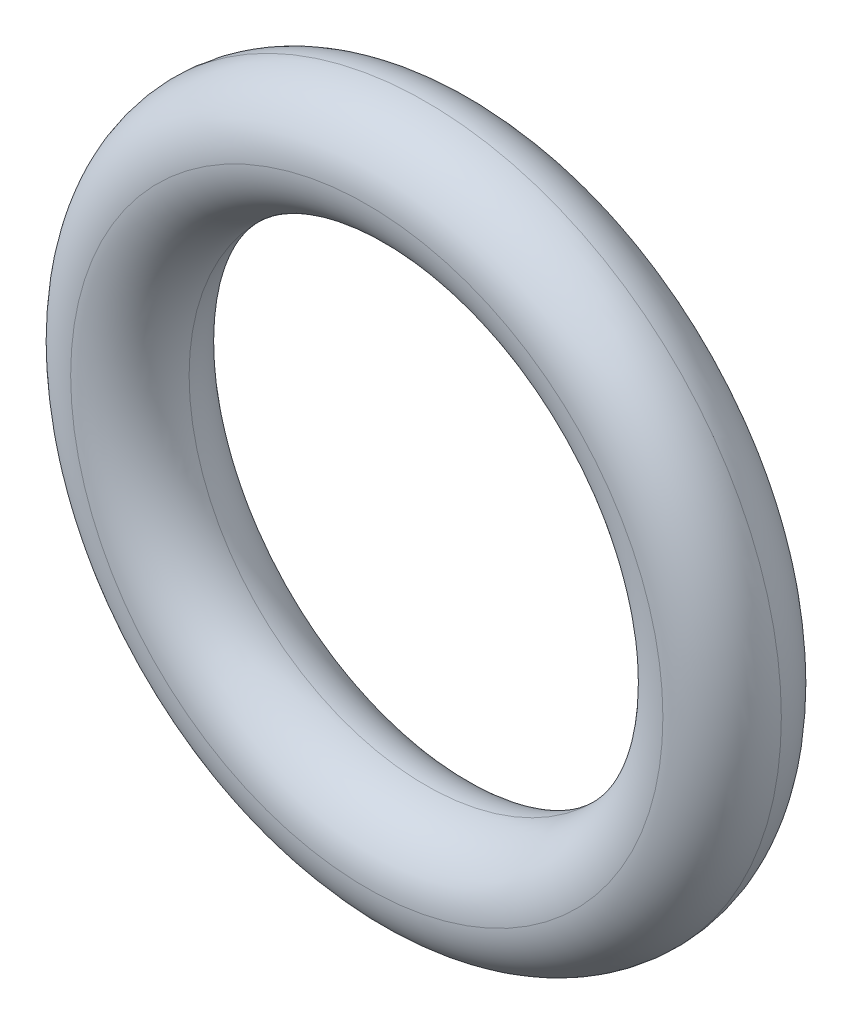
ISO-10303-21;
HEADER;
FILE_DESCRIPTION(('STEP AP214'),'2;1');
FILE_NAME('part.step','',(''),(''),'','','');
FILE_SCHEMA(('AUTOMOTIVE_DESIGN { 1 0 10303 214 1 1 1 1 }'));
ENDSEC;
DATA;
#1=APPLICATION_CONTEXT('core data for automotive mechanical design processes');
#2=APPLICATION_PROTOCOL_DEFINITION('international standard','automotive_design',2000,#1);
#3=PRODUCT_CONTEXT('',#1,'mechanical');
#4=PRODUCT('Part','Part','',(#3));
#5=PRODUCT_RELATED_PRODUCT_CATEGORY('part','',(#4));
#6=PRODUCT_DEFINITION_FORMATION('','',#4);
#7=PRODUCT_DEFINITION_CONTEXT('part definition',#1,'design');
#8=PRODUCT_DEFINITION('design','',#6,#7);
#9=PRODUCT_DEFINITION_SHAPE('','',#8);
#10=(LENGTH_UNIT() NAMED_UNIT(*) SI_UNIT(.MILLI.,.METRE.));
#11=(NAMED_UNIT(*) PLANE_ANGLE_UNIT() SI_UNIT($,.RADIAN.));
#12=(NAMED_UNIT(*) SI_UNIT($,.STERADIAN.) SOLID_ANGLE_UNIT());
#13=UNCERTAINTY_MEASURE_WITH_UNIT(LENGTH_MEASURE(1.E-05),#10,'distance_accuracy_value','');
#14=(GEOMETRIC_REPRESENTATION_CONTEXT(3) GLOBAL_UNCERTAINTY_ASSIGNED_CONTEXT((#13)) GLOBAL_UNIT_ASSIGNED_CONTEXT((#10,
#11,#12)) REPRESENTATION_CONTEXT('',''));
#15=CARTESIAN_POINT('',(0.,0.,0.));
#16=DIRECTION('',(0.,0.,1.));
#17=DIRECTION('',(1.,0.,0.));
#18=AXIS2_PLACEMENT_3D('',#15,#16,#17);
#19=CARTESIAN_POINT('',(0.,0.,12.7));
#20=DIRECTION('',(0.,0.,1.));
#21=DIRECTION('',(1.,0.,0.));
#22=AXIS2_PLACEMENT_3D('',#19,#20,#21);
#23=TOROIDAL_SURFACE('',#22,63.5,12.7);
#24=CARTESIAN_POINT('',(0.,0.,25.4));
#25=DIRECTION('',(0.,0.,1.));
#26=DIRECTION('',(1.,0.,0.));
#27=AXIS2_PLACEMENT_3D('',#24,#25,#26);
#28=CIRCLE('',#27,63.5);
#29=CARTESIAN_POINT('',(63.5,0.,25.4));
#30=VERTEX_POINT('',#29);
#31=EDGE_CURVE('E10',#30,#30,#28,.T.);
#32=ORIENTED_EDGE('',*,*,#31,.F.);
#33=EDGE_LOOP('',(#32));
#34=FACE_BOUND('',#33,.T.);
#35=CARTESIAN_POINT('',(0.,0.,12.7));
#36=DIRECTION('',(0.,0.,1.));
#37=DIRECTION('',(1.,0.,0.));
#38=AXIS2_PLACEMENT_3D('',#35,#36,#37);
#39=CIRCLE('',#38,76.2);
#40=CARTESIAN_POINT('',(76.2,0.,12.7));
#41=VERTEX_POINT('',#40);
#42=EDGE_CURVE('E52',#41,#41,#39,.F.);
#43=ORIENTED_EDGE('',*,*,#42,.F.);
#44=EDGE_LOOP('',(#43));
#45=FACE_BOUND('',#44,.T.);
#46=ADVANCED_FACE('F37',(#34,#45),#23,.T.);
#47=CARTESIAN_POINT('',(0.,0.,12.7));
#48=DIRECTION('',(0.,0.,1.));
#49=DIRECTION('',(1.,0.,0.));
#50=AXIS2_PLACEMENT_3D('',#47,#48,#49);
#51=TOROIDAL_SURFACE('',#50,63.5,12.7);
#52=CARTESIAN_POINT('',(0.,0.,0.));
#53=DIRECTION('',(0.,0.,1.));
#54=DIRECTION('',(1.,0.,0.));
#55=AXIS2_PLACEMENT_3D('',#52,#53,#54);
#56=CIRCLE('',#55,63.5);
#57=CARTESIAN_POINT('',(63.5,0.,0.));
#58=VERTEX_POINT('',#57);
#59=EDGE_CURVE('E46',#58,#58,#56,.F.);
#60=ORIENTED_EDGE('',*,*,#59,.F.);
#61=EDGE_LOOP('',(#60));
#62=FACE_BOUND('',#61,.T.);
#63=ORIENTED_EDGE('',*,*,#42,.T.);
#64=EDGE_LOOP('',(#63));
#65=FACE_BOUND('',#64,.T.);
#66=ADVANCED_FACE('F65',(#62,#65),#51,.T.);
#67=CARTESIAN_POINT('',(0.,0.,12.7));
#68=DIRECTION('',(0.,0.,1.));
#69=DIRECTION('',(1.,0.,0.));
#70=AXIS2_PLACEMENT_3D('',#67,#68,#69);
#71=TOROIDAL_SURFACE('',#70,63.5,12.7);
#72=ORIENTED_EDGE('',*,*,#59,.T.);
#73=EDGE_LOOP('',(#72));
#74=FACE_BOUND('',#73,.T.);
#75=CARTESIAN_POINT('',(0.,0.,12.7));
#76=DIRECTION('',(0.,0.,1.));
#77=DIRECTION('',(1.,0.,0.));
#78=AXIS2_PLACEMENT_3D('',#75,#76,#77);
#79=CIRCLE('',#78,50.8);
#80=CARTESIAN_POINT('',(50.8,0.,12.7));
#81=VERTEX_POINT('',#80);
#82=EDGE_CURVE('E41',#81,#81,#79,.F.);
#83=ORIENTED_EDGE('',*,*,#82,.F.);
#84=EDGE_LOOP('',(#83));
#85=FACE_BOUND('',#84,.T.);
#86=ADVANCED_FACE('F39',(#74,#85),#71,.T.);
#87=CARTESIAN_POINT('',(0.,0.,12.7));
#88=DIRECTION('',(0.,0.,1.));
#89=DIRECTION('',(1.,0.,0.));
#90=AXIS2_PLACEMENT_3D('',#87,#88,#89);
#91=TOROIDAL_SURFACE('',#90,63.5,12.7);
#92=ORIENTED_EDGE('',*,*,#31,.T.);
#93=EDGE_LOOP('',(#92));
#94=FACE_BOUND('',#93,.T.);
#95=ORIENTED_EDGE('',*,*,#82,.T.);
#96=EDGE_LOOP('',(#95));
#97=FACE_BOUND('',#96,.T.);
#98=ADVANCED_FACE('F62',(#94,#97),#91,.T.);
#99=CLOSED_SHELL('',(#46,#66,#86,#98));
#100=MANIFOLD_SOLID_BREP('B2',#99);
#101=ADVANCED_BREP_SHAPE_REPRESENTATION('',(#18,#100),#14);
#102=SHAPE_DEFINITION_REPRESENTATION(#9,#101);
ENDSEC;
END-ISO-10303-21;
